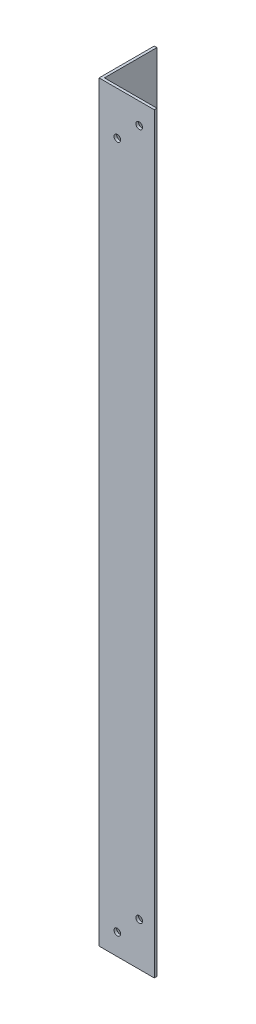
ISO-10303-21;
HEADER;
FILE_DESCRIPTION(('STEP AP214'),'2;1');
FILE_NAME('part.step','',(''),(''),'','','');
FILE_SCHEMA(('AUTOMOTIVE_DESIGN { 1 0 10303 214 1 1 1 1 }'));
ENDSEC;
DATA;
#1=APPLICATION_CONTEXT('core data for automotive mechanical design processes');
#2=APPLICATION_PROTOCOL_DEFINITION('international standard','automotive_design',2000,#1);
#3=PRODUCT_CONTEXT('',#1,'mechanical');
#4=PRODUCT('Part','Part','',(#3));
#5=PRODUCT_RELATED_PRODUCT_CATEGORY('part','',(#4));
#6=PRODUCT_DEFINITION_FORMATION('','',#4);
#7=PRODUCT_DEFINITION_CONTEXT('part definition',#1,'design');
#8=PRODUCT_DEFINITION('design','',#6,#7);
#9=PRODUCT_DEFINITION_SHAPE('','',#8);
#10=(LENGTH_UNIT() NAMED_UNIT(*) SI_UNIT(.MILLI.,.METRE.));
#11=(NAMED_UNIT(*) PLANE_ANGLE_UNIT() SI_UNIT($,.RADIAN.));
#12=(NAMED_UNIT(*) SI_UNIT($,.STERADIAN.) SOLID_ANGLE_UNIT());
#13=UNCERTAINTY_MEASURE_WITH_UNIT(LENGTH_MEASURE(1.E-05),#10,'distance_accuracy_value','');
#14=(GEOMETRIC_REPRESENTATION_CONTEXT(3) GLOBAL_UNCERTAINTY_ASSIGNED_CONTEXT((#13)) GLOBAL_UNIT_ASSIGNED_CONTEXT((#10,
#11,#12)) REPRESENTATION_CONTEXT('',''));
#15=CARTESIAN_POINT('',(0.,0.,0.));
#16=DIRECTION('',(0.,0.,1.));
#17=DIRECTION('',(1.,0.,0.));
#18=AXIS2_PLACEMENT_3D('',#15,#16,#17);
#19=CARTESIAN_POINT('',(0.,340.5,0.));
#20=DIRECTION('',(0.,0.,-1.));
#21=DIRECTION('',(-1.,0.,0.));
#22=AXIS2_PLACEMENT_3D('',#19,#20,#21);
#23=PLANE('',#22);
#24=CARTESIAN_POINT('',(18.17,330.863,0.));
#25=DIRECTION('',(0.,0.,-1.));
#26=DIRECTION('',(-1.,0.,0.));
#27=AXIS2_PLACEMENT_3D('',#24,#25,#26);
#28=CIRCLE('',#27,1.5);
#29=CARTESIAN_POINT('',(16.67,330.863,0.));
#30=VERTEX_POINT('',#29);
#31=EDGE_CURVE('E122',#30,#30,#28,.T.);
#32=ORIENTED_EDGE('',*,*,#31,.T.);
#33=EDGE_LOOP('',(#32));
#34=FACE_BOUND('',#33,.T.);
#35=CARTESIAN_POINT('',(8.27050506338833,320.963505063388,0.));
#36=DIRECTION('',(0.,0.,-1.));
#37=DIRECTION('',(-1.,0.,0.));
#38=AXIS2_PLACEMENT_3D('',#35,#36,#37);
#39=CIRCLE('',#38,1.5);
#40=CARTESIAN_POINT('',(6.77050506338833,320.963505063388,0.));
#41=VERTEX_POINT('',#40);
#42=EDGE_CURVE('E166',#41,#41,#39,.T.);
#43=ORIENTED_EDGE('',*,*,#42,.T.);
#44=EDGE_LOOP('',(#43));
#45=FACE_BOUND('',#44,.T.);
#46=CARTESIAN_POINT('',(18.17,19.5724949366117,0.));
#47=DIRECTION('',(0.,0.,-1.));
#48=DIRECTION('',(-1.,0.,0.));
#49=AXIS2_PLACEMENT_3D('',#46,#47,#48);
#50=CIRCLE('',#49,1.5);
#51=CARTESIAN_POINT('',(16.67,19.5724949366117,0.));
#52=VERTEX_POINT('',#51);
#53=EDGE_CURVE('E170',#52,#52,#50,.T.);
#54=ORIENTED_EDGE('',*,*,#53,.T.);
#55=EDGE_LOOP('',(#54));
#56=FACE_BOUND('',#55,.T.);
#57=CARTESIAN_POINT('',(8.27050506338833,9.673,0.));
#58=DIRECTION('',(0.,0.,-1.));
#59=DIRECTION('',(-1.,0.,0.));
#60=AXIS2_PLACEMENT_3D('',#57,#58,#59);
#61=CIRCLE('',#60,1.5);
#62=CARTESIAN_POINT('',(6.77050506338833,9.673,0.));
#63=VERTEX_POINT('',#62);
#64=EDGE_CURVE('E173',#63,#63,#61,.T.);
#65=ORIENTED_EDGE('',*,*,#64,.T.);
#66=EDGE_LOOP('',(#65));
#67=FACE_BOUND('',#66,.T.);
#68=DIRECTION('',(1.,0.,0.));
#69=VECTOR('',#68,1.);
#70=CARTESIAN_POINT('',(0.,0.,0.));
#71=LINE('',#70,#69);
#72=CARTESIAN_POINT('',(0.,0.,0.));
#73=VERTEX_POINT('',#72);
#74=CARTESIAN_POINT('',(25.,0.,0.));
#75=VERTEX_POINT('',#74);
#76=EDGE_CURVE('E118',#73,#75,#71,.T.);
#77=ORIENTED_EDGE('',*,*,#76,.T.);
#78=DIRECTION('',(0.,-1.,0.));
#79=VECTOR('',#78,1.);
#80=CARTESIAN_POINT('',(25.,340.5,0.));
#81=LINE('',#80,#79);
#82=CARTESIAN_POINT('',(25.,340.5,0.));
#83=VERTEX_POINT('',#82);
#84=EDGE_CURVE('E11',#83,#75,#81,.T.);
#85=ORIENTED_EDGE('',*,*,#84,.F.);
#86=DIRECTION('',(1.,0.,0.));
#87=VECTOR('',#86,1.);
#88=CARTESIAN_POINT('',(0.,340.5,0.));
#89=LINE('',#88,#87);
#90=CARTESIAN_POINT('',(0.,340.5,0.));
#91=VERTEX_POINT('',#90);
#92=EDGE_CURVE('E129',#91,#83,#89,.T.);
#93=ORIENTED_EDGE('',*,*,#92,.F.);
#94=DIRECTION('',(0.,-1.,0.));
#95=VECTOR('',#94,1.);
#96=CARTESIAN_POINT('',(0.,340.5,0.));
#97=LINE('',#96,#95);
#98=EDGE_CURVE('E114',#91,#73,#97,.T.);
#99=ORIENTED_EDGE('',*,*,#98,.T.);
#100=EDGE_LOOP('',(#77,#85,#93,#99));
#101=FACE_BOUND('',#100,.T.);
#102=ADVANCED_FACE('F34',(#34,#45,#56,#67,#101),#23,.F.);
#103=CARTESIAN_POINT('',(25.,340.5,0.));
#104=DIRECTION('',(-1.,0.,0.));
#105=DIRECTION('',(0.,0.,1.));
#106=AXIS2_PLACEMENT_3D('',#103,#104,#105);
#107=PLANE('',#106);
#108=DIRECTION('',(0.,0.,-1.));
#109=VECTOR('',#108,1.);
#110=CARTESIAN_POINT('',(25.,0.,0.));
#111=LINE('',#110,#109);
#112=CARTESIAN_POINT('',(25.,0.,-1.2));
#113=VERTEX_POINT('',#112);
#114=EDGE_CURVE('E121',#75,#113,#111,.T.);
#115=ORIENTED_EDGE('',*,*,#114,.T.);
#116=DIRECTION('',(0.,-1.,0.));
#117=VECTOR('',#116,1.);
#118=CARTESIAN_POINT('',(25.,340.5,-1.2));
#119=LINE('',#118,#117);
#120=CARTESIAN_POINT('',(25.,340.5,-1.2));
#121=VERTEX_POINT('',#120);
#122=EDGE_CURVE('E42',#121,#113,#119,.T.);
#123=ORIENTED_EDGE('',*,*,#122,.F.);
#124=DIRECTION('',(0.,0.,-1.));
#125=VECTOR('',#124,1.);
#126=CARTESIAN_POINT('',(25.,340.5,0.));
#127=LINE('',#126,#125);
#128=EDGE_CURVE('E87',#83,#121,#127,.T.);
#129=ORIENTED_EDGE('',*,*,#128,.F.);
#130=ORIENTED_EDGE('',*,*,#84,.T.);
#131=EDGE_LOOP('',(#115,#123,#129,#130));
#132=FACE_BOUND('',#131,.T.);
#133=ADVANCED_FACE('F153',(#132),#107,.F.);
#134=CARTESIAN_POINT('',(1.2,340.5,-1.2));
#135=DIRECTION('',(0.,0.,1.));
#136=DIRECTION('',(1.,0.,0.));
#137=AXIS2_PLACEMENT_3D('',#134,#135,#136);
#138=PLANE('',#137);
#139=CARTESIAN_POINT('',(18.17,330.863,-1.2));
#140=DIRECTION('',(0.,0.,-1.));
#141=DIRECTION('',(-1.,0.,0.));
#142=AXIS2_PLACEMENT_3D('',#139,#140,#141);
#143=CIRCLE('',#142,1.5);
#144=CARTESIAN_POINT('',(16.67,330.863,-1.2));
#145=VERTEX_POINT('',#144);
#146=EDGE_CURVE('E190',#145,#145,#143,.T.);
#147=ORIENTED_EDGE('',*,*,#146,.F.);
#148=EDGE_LOOP('',(#147));
#149=FACE_BOUND('',#148,.T.);
#150=CARTESIAN_POINT('',(8.27050506338833,320.963505063388,-1.2));
#151=DIRECTION('',(0.,0.,-1.));
#152=DIRECTION('',(-1.,0.,0.));
#153=AXIS2_PLACEMENT_3D('',#150,#151,#152);
#154=CIRCLE('',#153,1.5);
#155=CARTESIAN_POINT('',(6.77050506338833,320.963505063388,-1.2));
#156=VERTEX_POINT('',#155);
#157=EDGE_CURVE('E186',#156,#156,#154,.T.);
#158=ORIENTED_EDGE('',*,*,#157,.F.);
#159=EDGE_LOOP('',(#158));
#160=FACE_BOUND('',#159,.T.);
#161=CARTESIAN_POINT('',(18.17,19.5724949366117,-1.2));
#162=DIRECTION('',(0.,0.,-1.));
#163=DIRECTION('',(-1.,0.,0.));
#164=AXIS2_PLACEMENT_3D('',#161,#162,#163);
#165=CIRCLE('',#164,1.5);
#166=CARTESIAN_POINT('',(16.67,19.5724949366117,-1.2));
#167=VERTEX_POINT('',#166);
#168=EDGE_CURVE('E175',#167,#167,#165,.T.);
#169=ORIENTED_EDGE('',*,*,#168,.F.);
#170=EDGE_LOOP('',(#169));
#171=FACE_BOUND('',#170,.T.);
#172=CARTESIAN_POINT('',(8.27050506338833,9.673,-1.2));
#173=DIRECTION('',(0.,0.,-1.));
#174=DIRECTION('',(-1.,0.,0.));
#175=AXIS2_PLACEMENT_3D('',#172,#173,#174);
#176=CIRCLE('',#175,1.5);
#177=CARTESIAN_POINT('',(6.77050506338833,9.673,-1.2));
#178=VERTEX_POINT('',#177);
#179=EDGE_CURVE('E176',#178,#178,#176,.T.);
#180=ORIENTED_EDGE('',*,*,#179,.F.);
#181=EDGE_LOOP('',(#180));
#182=FACE_BOUND('',#181,.T.);
#183=DIRECTION('',(-1.,0.,0.));
#184=VECTOR('',#183,1.);
#185=CARTESIAN_POINT('',(1.2,0.,-1.2));
#186=LINE('',#185,#184);
#187=CARTESIAN_POINT('',(1.2,0.,-1.2));
#188=VERTEX_POINT('',#187);
#189=EDGE_CURVE('E124',#113,#188,#186,.T.);
#190=ORIENTED_EDGE('',*,*,#189,.T.);
#191=DIRECTION('',(0.,-1.,0.));
#192=VECTOR('',#191,1.);
#193=CARTESIAN_POINT('',(1.2,340.5,-1.2));
#194=LINE('',#193,#192);
#195=CARTESIAN_POINT('',(1.2,340.5,-1.2));
#196=VERTEX_POINT('',#195);
#197=EDGE_CURVE('E109',#196,#188,#194,.T.);
#198=ORIENTED_EDGE('',*,*,#197,.F.);
#199=DIRECTION('',(-1.,0.,0.));
#200=VECTOR('',#199,1.);
#201=CARTESIAN_POINT('',(1.2,340.5,-1.2));
#202=LINE('',#201,#200);
#203=EDGE_CURVE('E100',#121,#196,#202,.T.);
#204=ORIENTED_EDGE('',*,*,#203,.F.);
#205=ORIENTED_EDGE('',*,*,#122,.T.);
#206=EDGE_LOOP('',(#190,#198,#204,#205));
#207=FACE_BOUND('',#206,.T.);
#208=ADVANCED_FACE('F135',(#149,#160,#171,#182,#207),#138,.F.);
#209=CARTESIAN_POINT('',(1.2,340.5,-25.));
#210=DIRECTION('',(-1.,0.,0.));
#211=DIRECTION('',(0.,0.,1.));
#212=AXIS2_PLACEMENT_3D('',#209,#210,#211);
#213=PLANE('',#212);
#214=DIRECTION('',(0.,0.,-1.));
#215=VECTOR('',#214,1.);
#216=CARTESIAN_POINT('',(1.2,0.,-25.));
#217=LINE('',#216,#215);
#218=CARTESIAN_POINT('',(1.2,0.,-25.));
#219=VERTEX_POINT('',#218);
#220=EDGE_CURVE('E108',#188,#219,#217,.T.);
#221=ORIENTED_EDGE('',*,*,#220,.T.);
#222=DIRECTION('',(0.,-1.,0.));
#223=VECTOR('',#222,1.);
#224=CARTESIAN_POINT('',(1.2,340.5,-25.));
#225=LINE('',#224,#223);
#226=CARTESIAN_POINT('',(1.2,340.5,-25.));
#227=VERTEX_POINT('',#226);
#228=EDGE_CURVE('E105',#227,#219,#225,.T.);
#229=ORIENTED_EDGE('',*,*,#228,.F.);
#230=DIRECTION('',(0.,0.,-1.));
#231=VECTOR('',#230,1.);
#232=CARTESIAN_POINT('',(1.2,340.5,-25.));
#233=LINE('',#232,#231);
#234=EDGE_CURVE('E94',#196,#227,#233,.T.);
#235=ORIENTED_EDGE('',*,*,#234,.F.);
#236=ORIENTED_EDGE('',*,*,#197,.T.);
#237=EDGE_LOOP('',(#221,#229,#235,#236));
#238=FACE_BOUND('',#237,.T.);
#239=ADVANCED_FACE('F106',(#238),#213,.F.);
#240=CARTESIAN_POINT('',(0.,340.5,-25.));
#241=DIRECTION('',(0.,0.,1.));
#242=DIRECTION('',(1.,0.,0.));
#243=AXIS2_PLACEMENT_3D('',#240,#241,#242);
#244=PLANE('',#243);
#245=DIRECTION('',(-1.,0.,0.));
#246=VECTOR('',#245,1.);
#247=CARTESIAN_POINT('',(0.,0.,-25.));
#248=LINE('',#247,#246);
#249=CARTESIAN_POINT('',(0.,0.,-25.));
#250=VERTEX_POINT('',#249);
#251=EDGE_CURVE('E73',#219,#250,#248,.T.);
#252=ORIENTED_EDGE('',*,*,#251,.T.);
#253=DIRECTION('',(0.,-1.,0.));
#254=VECTOR('',#253,1.);
#255=CARTESIAN_POINT('',(0.,340.5,-25.));
#256=LINE('',#255,#254);
#257=CARTESIAN_POINT('',(0.,340.5,-25.));
#258=VERTEX_POINT('',#257);
#259=EDGE_CURVE('E110',#258,#250,#256,.T.);
#260=ORIENTED_EDGE('',*,*,#259,.F.);
#261=DIRECTION('',(-1.,0.,0.));
#262=VECTOR('',#261,1.);
#263=CARTESIAN_POINT('',(0.,340.5,-25.));
#264=LINE('',#263,#262);
#265=EDGE_CURVE('E98',#227,#258,#264,.T.);
#266=ORIENTED_EDGE('',*,*,#265,.F.);
#267=ORIENTED_EDGE('',*,*,#228,.T.);
#268=EDGE_LOOP('',(#252,#260,#266,#267));
#269=FACE_BOUND('',#268,.T.);
#270=ADVANCED_FACE('F112',(#269),#244,.F.);
#271=CARTESIAN_POINT('',(0.,340.5,0.));
#272=DIRECTION('',(1.,0.,0.));
#273=DIRECTION('',(0.,0.,-1.));
#274=AXIS2_PLACEMENT_3D('',#271,#272,#273);
#275=PLANE('',#274);
#276=DIRECTION('',(0.,0.,1.));
#277=VECTOR('',#276,1.);
#278=CARTESIAN_POINT('',(0.,0.,0.));
#279=LINE('',#278,#277);
#280=EDGE_CURVE('E79',#250,#73,#279,.T.);
#281=ORIENTED_EDGE('',*,*,#280,.T.);
#282=ORIENTED_EDGE('',*,*,#98,.F.);
#283=DIRECTION('',(0.,0.,1.));
#284=VECTOR('',#283,1.);
#285=CARTESIAN_POINT('',(0.,340.5,0.));
#286=LINE('',#285,#284);
#287=EDGE_CURVE('E50',#258,#91,#286,.T.);
#288=ORIENTED_EDGE('',*,*,#287,.F.);
#289=ORIENTED_EDGE('',*,*,#259,.T.);
#290=EDGE_LOOP('',(#281,#282,#288,#289));
#291=FACE_BOUND('',#290,.T.);
#292=ADVANCED_FACE('F142',(#291),#275,.F.);
#293=CARTESIAN_POINT('',(0.,340.5,0.));
#294=DIRECTION('',(0.,1.,0.));
#295=DIRECTION('',(0.,0.,1.));
#296=AXIS2_PLACEMENT_3D('',#293,#294,#295);
#297=PLANE('',#296);
#298=ORIENTED_EDGE('',*,*,#92,.T.);
#299=ORIENTED_EDGE('',*,*,#128,.T.);
#300=ORIENTED_EDGE('',*,*,#203,.T.);
#301=ORIENTED_EDGE('',*,*,#234,.T.);
#302=ORIENTED_EDGE('',*,*,#265,.T.);
#303=ORIENTED_EDGE('',*,*,#287,.T.);
#304=EDGE_LOOP('',(#298,#299,#300,#301,#302,#303));
#305=FACE_BOUND('',#304,.T.);
#306=ADVANCED_FACE('F96',(#305),#297,.T.);
#307=CARTESIAN_POINT('',(0.,0.,0.));
#308=DIRECTION('',(0.,1.,0.));
#309=DIRECTION('',(0.,0.,1.));
#310=AXIS2_PLACEMENT_3D('',#307,#308,#309);
#311=PLANE('',#310);
#312=ORIENTED_EDGE('',*,*,#76,.F.);
#313=ORIENTED_EDGE('',*,*,#280,.F.);
#314=ORIENTED_EDGE('',*,*,#251,.F.);
#315=ORIENTED_EDGE('',*,*,#220,.F.);
#316=ORIENTED_EDGE('',*,*,#189,.F.);
#317=ORIENTED_EDGE('',*,*,#114,.F.);
#318=EDGE_LOOP('',(#312,#313,#314,#315,#316,#317));
#319=FACE_BOUND('',#318,.T.);
#320=ADVANCED_FACE('F138',(#319),#311,.F.);
#321=CARTESIAN_POINT('',(8.27050506338833,9.673,0.));
#322=DIRECTION('',(0.,0.,-1.));
#323=DIRECTION('',(-1.,0.,0.));
#324=AXIS2_PLACEMENT_3D('',#321,#322,#323);
#325=CYLINDRICAL_SURFACE('',#324,1.5);
#326=ORIENTED_EDGE('',*,*,#64,.F.);
#327=EDGE_LOOP('',(#326));
#328=FACE_BOUND('',#327,.T.);
#329=ORIENTED_EDGE('',*,*,#179,.T.);
#330=EDGE_LOOP('',(#329));
#331=FACE_BOUND('',#330,.T.);
#332=ADVANCED_FACE('F205',(#328,#331),#325,.F.);
#333=CARTESIAN_POINT('',(18.17,19.5724949366117,0.));
#334=DIRECTION('',(0.,0.,-1.));
#335=DIRECTION('',(-1.,0.,0.));
#336=AXIS2_PLACEMENT_3D('',#333,#334,#335);
#337=CYLINDRICAL_SURFACE('',#336,1.5);
#338=ORIENTED_EDGE('',*,*,#53,.F.);
#339=EDGE_LOOP('',(#338));
#340=FACE_BOUND('',#339,.T.);
#341=ORIENTED_EDGE('',*,*,#168,.T.);
#342=EDGE_LOOP('',(#341));
#343=FACE_BOUND('',#342,.T.);
#344=ADVANCED_FACE('F207',(#340,#343),#337,.F.);
#345=CARTESIAN_POINT('',(8.27050506338833,320.963505063388,0.));
#346=DIRECTION('',(0.,0.,-1.));
#347=DIRECTION('',(-1.,0.,0.));
#348=AXIS2_PLACEMENT_3D('',#345,#346,#347);
#349=CYLINDRICAL_SURFACE('',#348,1.5);
#350=ORIENTED_EDGE('',*,*,#42,.F.);
#351=EDGE_LOOP('',(#350));
#352=FACE_BOUND('',#351,.T.);
#353=ORIENTED_EDGE('',*,*,#157,.T.);
#354=EDGE_LOOP('',(#353));
#355=FACE_BOUND('',#354,.T.);
#356=ADVANCED_FACE('F213',(#352,#355),#349,.F.);
#357=CARTESIAN_POINT('',(18.17,330.863,0.));
#358=DIRECTION('',(0.,0.,-1.));
#359=DIRECTION('',(-1.,0.,0.));
#360=AXIS2_PLACEMENT_3D('',#357,#358,#359);
#361=CYLINDRICAL_SURFACE('',#360,1.5);
#362=ORIENTED_EDGE('',*,*,#31,.F.);
#363=EDGE_LOOP('',(#362));
#364=FACE_BOUND('',#363,.T.);
#365=ORIENTED_EDGE('',*,*,#146,.T.);
#366=EDGE_LOOP('',(#365));
#367=FACE_BOUND('',#366,.T.);
#368=ADVANCED_FACE('F195',(#364,#367),#361,.F.);
#369=CLOSED_SHELL('',(#102,#133,#208,#239,#270,#292,#306,#320,#332,#344,#356,#368));
#370=MANIFOLD_SOLID_BREP('B2',#369);
#371=ADVANCED_BREP_SHAPE_REPRESENTATION('',(#18,#370),#14);
#372=SHAPE_DEFINITION_REPRESENTATION(#9,#371);
ENDSEC;
END-ISO-10303-21;
